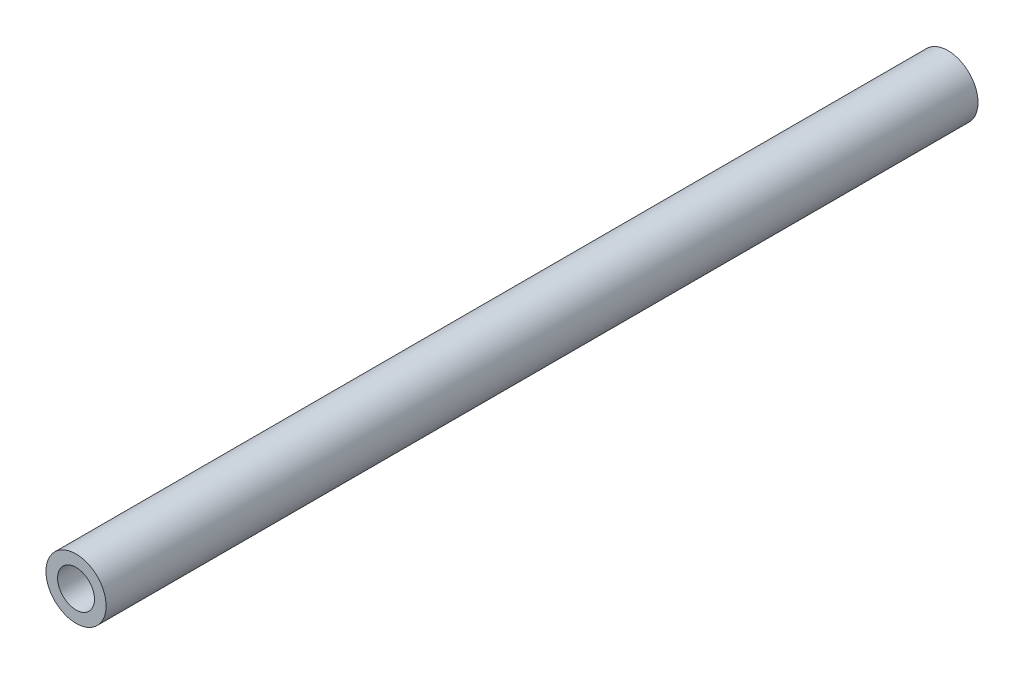
ISO-10303-21;
HEADER;
FILE_DESCRIPTION(('STEP AP214'),'2;1');
FILE_NAME('part.step','',(''),(''),'','','');
FILE_SCHEMA(('AUTOMOTIVE_DESIGN { 1 0 10303 214 1 1 1 1 }'));
ENDSEC;
DATA;
#1=APPLICATION_CONTEXT('core data for automotive mechanical design processes');
#2=APPLICATION_PROTOCOL_DEFINITION('international standard','automotive_design',2000,#1);
#3=PRODUCT_CONTEXT('',#1,'mechanical');
#4=PRODUCT('Part','Part','',(#3));
#5=PRODUCT_RELATED_PRODUCT_CATEGORY('part','',(#4));
#6=PRODUCT_DEFINITION_FORMATION('','',#4);
#7=PRODUCT_DEFINITION_CONTEXT('part definition',#1,'design');
#8=PRODUCT_DEFINITION('design','',#6,#7);
#9=PRODUCT_DEFINITION_SHAPE('','',#8);
#10=(LENGTH_UNIT() NAMED_UNIT(*) SI_UNIT(.MILLI.,.METRE.));
#11=(NAMED_UNIT(*) PLANE_ANGLE_UNIT() SI_UNIT($,.RADIAN.));
#12=(NAMED_UNIT(*) SI_UNIT($,.STERADIAN.) SOLID_ANGLE_UNIT());
#13=UNCERTAINTY_MEASURE_WITH_UNIT(LENGTH_MEASURE(1.E-05),#10,'distance_accuracy_value','');
#14=(GEOMETRIC_REPRESENTATION_CONTEXT(3) GLOBAL_UNCERTAINTY_ASSIGNED_CONTEXT((#13)) GLOBAL_UNIT_ASSIGNED_CONTEXT((#10,
#11,#12)) REPRESENTATION_CONTEXT('',''));
#15=CARTESIAN_POINT('',(0.,0.,0.));
#16=DIRECTION('',(0.,0.,1.));
#17=DIRECTION('',(1.,0.,0.));
#18=AXIS2_PLACEMENT_3D('',#15,#16,#17);
#19=CARTESIAN_POINT('',(0.,0.,300.));
#20=DIRECTION('',(0.,0.,1.));
#21=DIRECTION('',(1.,0.,0.));
#22=AXIS2_PLACEMENT_3D('',#19,#20,#21);
#23=PLANE('',#22);
#24=CARTESIAN_POINT('',(0.,0.,300.));
#25=DIRECTION('',(0.,0.,1.));
#26=DIRECTION('',(1.,0.,0.));
#27=AXIS2_PLACEMENT_3D('',#24,#25,#26);
#28=CIRCLE('',#27,10.35);
#29=CARTESIAN_POINT('',(10.35,0.,300.));
#30=VERTEX_POINT('',#29);
#31=EDGE_CURVE('E10',#30,#30,#28,.T.);
#32=ORIENTED_EDGE('',*,*,#31,.T.);
#33=EDGE_LOOP('',(#32));
#34=FACE_BOUND('',#33,.T.);
#35=CARTESIAN_POINT('',(0.,0.,300.));
#36=DIRECTION('',(0.,0.,1.));
#37=DIRECTION('',(1.,0.,0.));
#38=AXIS2_PLACEMENT_3D('',#35,#36,#37);
#39=CIRCLE('',#38,6.35);
#40=CARTESIAN_POINT('',(6.35,0.,300.));
#41=VERTEX_POINT('',#40);
#42=EDGE_CURVE('E50',#41,#41,#39,.T.);
#43=ORIENTED_EDGE('',*,*,#42,.F.);
#44=EDGE_LOOP('',(#43));
#45=FACE_BOUND('',#44,.T.);
#46=ADVANCED_FACE('F37',(#34,#45),#23,.T.);
#47=CARTESIAN_POINT('',(0.,0.,0.));
#48=DIRECTION('',(0.,0.,1.));
#49=DIRECTION('',(1.,0.,0.));
#50=AXIS2_PLACEMENT_3D('',#47,#48,#49);
#51=PLANE('',#50);
#52=CARTESIAN_POINT('',(0.,0.,0.));
#53=DIRECTION('',(0.,0.,1.));
#54=DIRECTION('',(1.,0.,0.));
#55=AXIS2_PLACEMENT_3D('',#52,#53,#54);
#56=CIRCLE('',#55,10.35);
#57=CARTESIAN_POINT('',(10.35,0.,0.));
#58=VERTEX_POINT('',#57);
#59=EDGE_CURVE('E41',#58,#58,#56,.T.);
#60=ORIENTED_EDGE('',*,*,#59,.F.);
#61=EDGE_LOOP('',(#60));
#62=FACE_BOUND('',#61,.T.);
#63=CARTESIAN_POINT('',(0.,0.,0.));
#64=DIRECTION('',(0.,0.,1.));
#65=DIRECTION('',(1.,0.,0.));
#66=AXIS2_PLACEMENT_3D('',#63,#64,#65);
#67=CIRCLE('',#66,6.35);
#68=CARTESIAN_POINT('',(6.35,0.,0.));
#69=VERTEX_POINT('',#68);
#70=EDGE_CURVE('E52',#69,#69,#67,.T.);
#71=ORIENTED_EDGE('',*,*,#70,.T.);
#72=EDGE_LOOP('',(#71));
#73=FACE_BOUND('',#72,.T.);
#74=ADVANCED_FACE('F64',(#62,#73),#51,.F.);
#75=CARTESIAN_POINT('',(0.,0.,300.));
#76=DIRECTION('',(0.,0.,-1.));
#77=DIRECTION('',(-1.,0.,0.));
#78=AXIS2_PLACEMENT_3D('',#75,#76,#77);
#79=CYLINDRICAL_SURFACE('',#78,10.35);
#80=ORIENTED_EDGE('',*,*,#31,.F.);
#81=EDGE_LOOP('',(#80));
#82=FACE_BOUND('',#81,.T.);
#83=ORIENTED_EDGE('',*,*,#59,.T.);
#84=EDGE_LOOP('',(#83));
#85=FACE_BOUND('',#84,.T.);
#86=ADVANCED_FACE('F39',(#82,#85),#79,.T.);
#87=CARTESIAN_POINT('',(0.,0.,300.));
#88=DIRECTION('',(0.,0.,-1.));
#89=DIRECTION('',(-1.,0.,0.));
#90=AXIS2_PLACEMENT_3D('',#87,#88,#89);
#91=CYLINDRICAL_SURFACE('',#90,6.35);
#92=ORIENTED_EDGE('',*,*,#42,.T.);
#93=EDGE_LOOP('',(#92));
#94=FACE_BOUND('',#93,.T.);
#95=ORIENTED_EDGE('',*,*,#70,.F.);
#96=EDGE_LOOP('',(#95));
#97=FACE_BOUND('',#96,.T.);
#98=ADVANCED_FACE('F60',(#94,#97),#91,.F.);
#99=CLOSED_SHELL('',(#46,#74,#86,#98));
#100=MANIFOLD_SOLID_BREP('B2',#99);
#101=ADVANCED_BREP_SHAPE_REPRESENTATION('',(#18,#100),#14);
#102=SHAPE_DEFINITION_REPRESENTATION(#9,#101);
ENDSEC;
END-ISO-10303-21;
